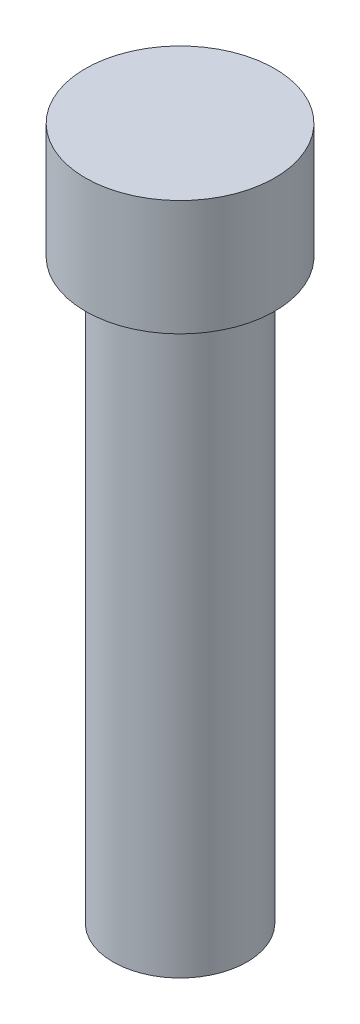
ISO-10303-21;
HEADER;
FILE_DESCRIPTION(('STEP AP214'),'2;1');
FILE_NAME('part.step','',(''),(''),'','','');
FILE_SCHEMA(('AUTOMOTIVE_DESIGN { 1 0 10303 214 1 1 1 1 }'));
ENDSEC;
DATA;
#1=APPLICATION_CONTEXT('core data for automotive mechanical design processes');
#2=APPLICATION_PROTOCOL_DEFINITION('international standard','automotive_design',2000,#1);
#3=PRODUCT_CONTEXT('',#1,'mechanical');
#4=PRODUCT('Part','Part','',(#3));
#5=PRODUCT_RELATED_PRODUCT_CATEGORY('part','',(#4));
#6=PRODUCT_DEFINITION_FORMATION('','',#4);
#7=PRODUCT_DEFINITION_CONTEXT('part definition',#1,'design');
#8=PRODUCT_DEFINITION('design','',#6,#7);
#9=PRODUCT_DEFINITION_SHAPE('','',#8);
#10=(LENGTH_UNIT() NAMED_UNIT(*) SI_UNIT(.MILLI.,.METRE.));
#11=(NAMED_UNIT(*) PLANE_ANGLE_UNIT() SI_UNIT($,.RADIAN.));
#12=(NAMED_UNIT(*) SI_UNIT($,.STERADIAN.) SOLID_ANGLE_UNIT());
#13=UNCERTAINTY_MEASURE_WITH_UNIT(LENGTH_MEASURE(1.E-05),#10,'distance_accuracy_value','');
#14=(GEOMETRIC_REPRESENTATION_CONTEXT(3) GLOBAL_UNCERTAINTY_ASSIGNED_CONTEXT((#13)) GLOBAL_UNIT_ASSIGNED_CONTEXT((#10,
#11,#12)) REPRESENTATION_CONTEXT('',''));
#15=CARTESIAN_POINT('',(0.,0.,0.));
#16=DIRECTION('',(0.,0.,1.));
#17=DIRECTION('',(1.,0.,0.));
#18=AXIS2_PLACEMENT_3D('',#15,#16,#17);
#19=CARTESIAN_POINT('',(0.,25.,0.));
#20=DIRECTION('',(0.,-1.,0.));
#21=DIRECTION('',(0.,0.,-1.));
#22=AXIS2_PLACEMENT_3D('',#19,#20,#21);
#23=CYLINDRICAL_SURFACE('',#22,2.9);
#24=CARTESIAN_POINT('',(0.,25.,0.));
#25=DIRECTION('',(0.,1.,0.));
#26=DIRECTION('',(0.,0.,1.));
#27=AXIS2_PLACEMENT_3D('',#24,#25,#26);
#28=CIRCLE('',#27,2.9);
#29=CARTESIAN_POINT('',(0.,25.,2.9));
#30=VERTEX_POINT('',#29);
#31=EDGE_CURVE('E10',#30,#30,#28,.T.);
#32=ORIENTED_EDGE('',*,*,#31,.F.);
#33=EDGE_LOOP('',(#32));
#34=FACE_BOUND('',#33,.T.);
#35=CARTESIAN_POINT('',(0.,0.,0.));
#36=DIRECTION('',(0.,1.,0.));
#37=DIRECTION('',(0.,0.,1.));
#38=AXIS2_PLACEMENT_3D('',#35,#36,#37);
#39=CIRCLE('',#38,2.9);
#40=CARTESIAN_POINT('',(0.,0.,2.9));
#41=VERTEX_POINT('',#40);
#42=EDGE_CURVE('E46',#41,#41,#39,.T.);
#43=ORIENTED_EDGE('',*,*,#42,.T.);
#44=EDGE_LOOP('',(#43));
#45=FACE_BOUND('',#44,.T.);
#46=ADVANCED_FACE('F43',(#34,#45),#23,.T.);
#47=CARTESIAN_POINT('',(0.,0.,0.));
#48=DIRECTION('',(0.,1.,0.));
#49=DIRECTION('',(0.,0.,1.));
#50=AXIS2_PLACEMENT_3D('',#47,#48,#49);
#51=PLANE('',#50);
#52=ORIENTED_EDGE('',*,*,#42,.F.);
#53=EDGE_LOOP('',(#52));
#54=FACE_BOUND('',#53,.T.);
#55=ADVANCED_FACE('F70',(#54),#51,.F.);
#56=CARTESIAN_POINT('',(0.,30.,0.));
#57=DIRECTION('',(0.,-1.,0.));
#58=DIRECTION('',(0.,0.,-1.));
#59=AXIS2_PLACEMENT_3D('',#56,#57,#58);
#60=CYLINDRICAL_SURFACE('',#59,4.1);
#61=CARTESIAN_POINT('',(0.,30.,0.));
#62=DIRECTION('',(0.,1.,0.));
#63=DIRECTION('',(0.,0.,1.));
#64=AXIS2_PLACEMENT_3D('',#61,#62,#63);
#65=CIRCLE('',#64,4.1);
#66=CARTESIAN_POINT('',(0.,30.,4.1));
#67=VERTEX_POINT('',#66);
#68=EDGE_CURVE('E55',#67,#67,#65,.T.);
#69=ORIENTED_EDGE('',*,*,#68,.F.);
#70=EDGE_LOOP('',(#69));
#71=FACE_BOUND('',#70,.T.);
#72=CARTESIAN_POINT('',(0.,25.,0.));
#73=DIRECTION('',(0.,1.,0.));
#74=DIRECTION('',(0.,0.,1.));
#75=AXIS2_PLACEMENT_3D('',#72,#73,#74);
#76=CIRCLE('',#75,4.1);
#77=CARTESIAN_POINT('',(0.,25.,4.1));
#78=VERTEX_POINT('',#77);
#79=EDGE_CURVE('E57',#78,#78,#76,.T.);
#80=ORIENTED_EDGE('',*,*,#79,.T.);
#81=EDGE_LOOP('',(#80));
#82=FACE_BOUND('',#81,.T.);
#83=ADVANCED_FACE('F67',(#71,#82),#60,.T.);
#84=CARTESIAN_POINT('',(0.,30.,0.));
#85=DIRECTION('',(0.,1.,0.));
#86=DIRECTION('',(0.,0.,1.));
#87=AXIS2_PLACEMENT_3D('',#84,#85,#86);
#88=PLANE('',#87);
#89=ORIENTED_EDGE('',*,*,#68,.T.);
#90=EDGE_LOOP('',(#89));
#91=FACE_BOUND('',#90,.T.);
#92=ADVANCED_FACE('F65',(#91),#88,.T.);
#93=CARTESIAN_POINT('',(0.,25.,0.));
#94=DIRECTION('',(0.,1.,0.));
#95=DIRECTION('',(0.,0.,1.));
#96=AXIS2_PLACEMENT_3D('',#93,#94,#95);
#97=PLANE('',#96);
#98=ORIENTED_EDGE('',*,*,#31,.T.);
#99=EDGE_LOOP('',(#98));
#100=FACE_BOUND('',#99,.T.);
#101=ORIENTED_EDGE('',*,*,#79,.F.);
#102=EDGE_LOOP('',(#101));
#103=FACE_BOUND('',#102,.T.);
#104=ADVANCED_FACE('F74',(#100,#103),#97,.F.);
#105=CLOSED_SHELL('',(#46,#55,#83,#92,#104));
#106=MANIFOLD_SOLID_BREP('B2',#105);
#107=ADVANCED_BREP_SHAPE_REPRESENTATION('',(#18,#106),#14);
#108=SHAPE_DEFINITION_REPRESENTATION(#9,#107);
ENDSEC;
END-ISO-10303-21;
